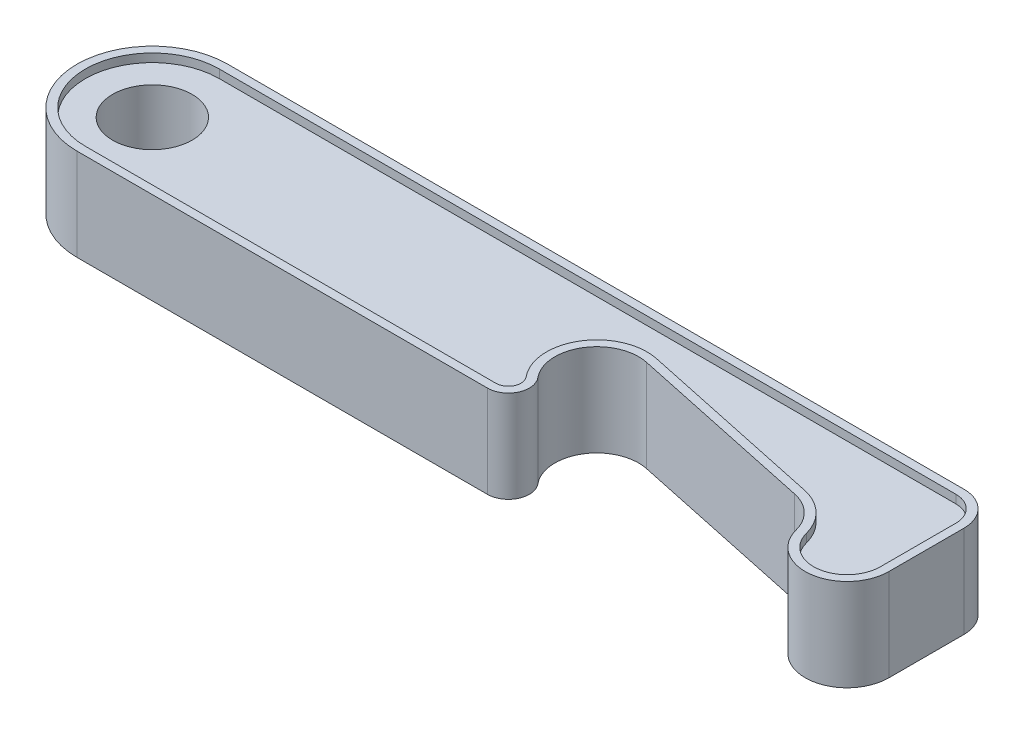
ISO-10303-21;
HEADER;
FILE_DESCRIPTION(('STEP AP214'),'2;1');
FILE_NAME('part.step','',(''),(''),'','','');
FILE_SCHEMA(('AUTOMOTIVE_DESIGN { 1 0 10303 214 1 1 1 1 }'));
ENDSEC;
DATA;
#1=APPLICATION_CONTEXT('core data for automotive mechanical design processes');
#2=APPLICATION_PROTOCOL_DEFINITION('international standard','automotive_design',2000,#1);
#3=PRODUCT_CONTEXT('',#1,'mechanical');
#4=PRODUCT('Part','Part','',(#3));
#5=PRODUCT_RELATED_PRODUCT_CATEGORY('part','',(#4));
#6=PRODUCT_DEFINITION_FORMATION('','',#4);
#7=PRODUCT_DEFINITION_CONTEXT('part definition',#1,'design');
#8=PRODUCT_DEFINITION('design','',#6,#7);
#9=PRODUCT_DEFINITION_SHAPE('','',#8);
#10=(LENGTH_UNIT() NAMED_UNIT(*) SI_UNIT(.MILLI.,.METRE.));
#11=(NAMED_UNIT(*) PLANE_ANGLE_UNIT() SI_UNIT($,.RADIAN.));
#12=(NAMED_UNIT(*) SI_UNIT($,.STERADIAN.) SOLID_ANGLE_UNIT());
#13=UNCERTAINTY_MEASURE_WITH_UNIT(LENGTH_MEASURE(1.E-05),#10,'distance_accuracy_value','');
#14=(GEOMETRIC_REPRESENTATION_CONTEXT(3) GLOBAL_UNCERTAINTY_ASSIGNED_CONTEXT((#13)) GLOBAL_UNIT_ASSIGNED_CONTEXT((#10,
#11,#12)) REPRESENTATION_CONTEXT('',''));
#15=CARTESIAN_POINT('',(0.,0.,0.));
#16=DIRECTION('',(0.,0.,1.));
#17=DIRECTION('',(1.,0.,0.));
#18=AXIS2_PLACEMENT_3D('',#15,#16,#17);
#19=CARTESIAN_POINT('',(0.,-4.5,0.));
#20=DIRECTION('',(0.,1.,0.));
#21=DIRECTION('',(0.,0.,1.));
#22=AXIS2_PLACEMENT_3D('',#19,#20,#21);
#23=CYLINDRICAL_SURFACE('',#22,4.75);
#24=CARTESIAN_POINT('',(0.,-4.5,0.));
#25=DIRECTION('',(0.,1.,0.));
#26=DIRECTION('',(0.,0.,1.));
#27=AXIS2_PLACEMENT_3D('',#24,#25,#26);
#28=CIRCLE('',#27,4.75);
#29=CARTESIAN_POINT('',(0.,-4.5,4.75));
#30=VERTEX_POINT('',#29);
#31=EDGE_CURVE('E447',#30,#30,#28,.T.);
#32=ORIENTED_EDGE('',*,*,#31,.F.);
#33=EDGE_LOOP('',(#32));
#34=FACE_BOUND('',#33,.T.);
#35=CARTESIAN_POINT('',(0.,4.5,0.));
#36=DIRECTION('',(0.,1.,0.));
#37=DIRECTION('',(0.,0.,1.));
#38=AXIS2_PLACEMENT_3D('',#35,#36,#37);
#39=CIRCLE('',#38,4.75);
#40=CARTESIAN_POINT('',(0.,4.5,4.75));
#41=VERTEX_POINT('',#40);
#42=EDGE_CURVE('E367',#41,#41,#39,.T.);
#43=ORIENTED_EDGE('',*,*,#42,.T.);
#44=EDGE_LOOP('',(#43));
#45=FACE_BOUND('',#44,.T.);
#46=ADVANCED_FACE('F43',(#34,#45),#23,.F.);
#47=CARTESIAN_POINT('',(0.,-4.5,0.));
#48=DIRECTION('',(0.,1.,0.));
#49=DIRECTION('',(0.,0.,1.));
#50=AXIS2_PLACEMENT_3D('',#47,#48,#49);
#51=PLANE('',#50);
#52=ORIENTED_EDGE('',*,*,#31,.T.);
#53=EDGE_LOOP('',(#52));
#54=FACE_BOUND('',#53,.T.);
#55=DIRECTION('',(1.,0.,0.));
#56=VECTOR('',#55,1.);
#57=CARTESIAN_POINT('',(0.,-4.5,-8.));
#58=LINE('',#57,#56);
#59=CARTESIAN_POINT('',(0.,-4.5,-8.));
#60=VERTEX_POINT('',#59);
#61=CARTESIAN_POINT('',(88.,-4.5,-8.));
#62=VERTEX_POINT('',#61);
#63=EDGE_CURVE('E446',#60,#62,#58,.T.);
#64=ORIENTED_EDGE('',*,*,#63,.T.);
#65=CARTESIAN_POINT('',(88.,-4.5,-5.));
#66=DIRECTION('',(0.,1.,0.));
#67=DIRECTION('',(0.,0.,1.));
#68=AXIS2_PLACEMENT_3D('',#65,#66,#67);
#69=CIRCLE('',#68,3.);
#70=CARTESIAN_POINT('',(91.,-4.5,-5.));
#71=VERTEX_POINT('',#70);
#72=EDGE_CURVE('E11',#71,#62,#69,.T.);
#73=ORIENTED_EDGE('',*,*,#72,.F.);
#74=DIRECTION('',(0.,0.,1.));
#75=VECTOR('',#74,1.);
#76=CARTESIAN_POINT('',(91.,-4.5,0.));
#77=LINE('',#76,#75);
#78=CARTESIAN_POINT('',(91.,-4.5,3.99999999999999));
#79=VERTEX_POINT('',#78);
#80=EDGE_CURVE('E49',#71,#79,#77,.T.);
#81=ORIENTED_EDGE('',*,*,#80,.T.);
#82=CARTESIAN_POINT('',(87.,-4.5,4.));
#83=DIRECTION('',(0.,1.,0.));
#84=DIRECTION('',(0.,0.,1.));
#85=AXIS2_PLACEMENT_3D('',#82,#83,#84);
#86=CIRCLE('',#85,4.);
#87=CARTESIAN_POINT('',(83.1270166537926,-4.5,5.));
#88=VERTEX_POINT('',#87);
#89=EDGE_CURVE('E468',#88,#79,#86,.T.);
#90=ORIENTED_EDGE('',*,*,#89,.F.);
#91=CARTESIAN_POINT('',(77.3175416344815,-4.5,6.5));
#92=DIRECTION('',(0.,1.,0.));
#93=DIRECTION('',(0.,0.,1.));
#94=AXIS2_PLACEMENT_3D('',#91,#92,#93);
#95=CIRCLE('',#94,6.);
#96=CARTESIAN_POINT('',(78.565011779388,-4.5,0.631114395597172));
#97=VERTEX_POINT('',#96);
#98=EDGE_CURVE('E464',#88,#97,#95,.T.);
#99=ORIENTED_EDGE('',*,*,#98,.T.);
#100=DIRECTION('',(0.978147600733805,0.,0.20791169081776));
#101=VECTOR('',#100,1.);
#102=CARTESIAN_POINT('',(3.26780239401435,-4.5,-15.3738015347056));
#103=LINE('',#102,#101);
#104=CARTESIAN_POINT('',(56.065011779388,-4.5,-4.15140824197835));
#105=VERTEX_POINT('',#104);
#106=EDGE_CURVE('E462',#105,#97,#103,.T.);
#107=ORIENTED_EDGE('',*,*,#106,.F.);
#108=CARTESIAN_POINT('',(54.8175416344815,-4.5,1.71747736242447));
#109=DIRECTION('',(0.,1.,0.));
#110=DIRECTION('',(0.,0.,1.));
#111=AXIS2_PLACEMENT_3D('',#108,#109,#110);
#112=CIRCLE('',#111,5.99999999999998);
#113=CARTESIAN_POINT('',(50.1956821146032,-4.5,5.5434954724849));
#114=VERTEX_POINT('',#113);
#115=EDGE_CURVE('E456',#105,#114,#112,.T.);
#116=ORIENTED_EDGE('',*,*,#115,.T.);
#117=CARTESIAN_POINT('',(49.0402172346336,-4.5,6.5));
#118=DIRECTION('',(0.,1.,0.));
#119=DIRECTION('',(0.,0.,1.));
#120=AXIS2_PLACEMENT_3D('',#117,#118,#119);
#121=CIRCLE('',#120,1.5);
#122=CARTESIAN_POINT('',(49.0402172346336,-4.5,8.));
#123=VERTEX_POINT('',#122);
#124=EDGE_CURVE('E457',#123,#114,#121,.T.);
#125=ORIENTED_EDGE('',*,*,#124,.F.);
#126=DIRECTION('',(1.,0.,0.));
#127=VECTOR('',#126,1.);
#128=CARTESIAN_POINT('',(0.,-4.5,8.));
#129=LINE('',#128,#127);
#130=CARTESIAN_POINT('',(0.,-4.5,8.));
#131=VERTEX_POINT('',#130);
#132=EDGE_CURVE('E452',#131,#123,#129,.T.);
#133=ORIENTED_EDGE('',*,*,#132,.F.);
#134=CARTESIAN_POINT('',(0.,-4.5,0.));
#135=DIRECTION('',(0.,1.,0.));
#136=DIRECTION('',(0.,0.,1.));
#137=AXIS2_PLACEMENT_3D('',#134,#135,#136);
#138=CIRCLE('',#137,8.);
#139=EDGE_CURVE('E455',#60,#131,#138,.T.);
#140=ORIENTED_EDGE('',*,*,#139,.F.);
#141=EDGE_LOOP('',(#64,#73,#81,#90,#99,#107,#116,#125,#133,#140));
#142=FACE_BOUND('',#141,.T.);
#143=ADVANCED_FACE('F473',(#54,#142),#51,.F.);
#144=CARTESIAN_POINT('',(0.,4.5,0.));
#145=DIRECTION('',(0.,1.,0.));
#146=DIRECTION('',(0.,0.,1.));
#147=AXIS2_PLACEMENT_3D('',#144,#145,#146);
#148=PLANE('',#147);
#149=ORIENTED_EDGE('',*,*,#42,.F.);
#150=EDGE_LOOP('',(#149));
#151=FACE_BOUND('',#150,.T.);
#152=DIRECTION('',(1.,0.,0.));
#153=VECTOR('',#152,1.);
#154=CARTESIAN_POINT('',(0.,4.5,-8.));
#155=LINE('',#154,#153);
#156=CARTESIAN_POINT('',(0.,4.5,-8.));
#157=VERTEX_POINT('',#156);
#158=CARTESIAN_POINT('',(88.,4.5,-8.));
#159=VERTEX_POINT('',#158);
#160=EDGE_CURVE('E422',#157,#159,#155,.T.);
#161=ORIENTED_EDGE('',*,*,#160,.F.);
#162=CARTESIAN_POINT('',(0.,4.5,0.));
#163=DIRECTION('',(0.,1.,0.));
#164=DIRECTION('',(0.,0.,1.));
#165=AXIS2_PLACEMENT_3D('',#162,#163,#164);
#166=CIRCLE('',#165,8.);
#167=CARTESIAN_POINT('',(0.,4.5,8.));
#168=VERTEX_POINT('',#167);
#169=EDGE_CURVE('E250',#157,#168,#166,.T.);
#170=ORIENTED_EDGE('',*,*,#169,.T.);
#171=DIRECTION('',(1.,0.,0.));
#172=VECTOR('',#171,1.);
#173=CARTESIAN_POINT('',(0.,4.5,8.));
#174=LINE('',#173,#172);
#175=CARTESIAN_POINT('',(49.0402172346336,4.5,8.));
#176=VERTEX_POINT('',#175);
#177=EDGE_CURVE('E428',#168,#176,#174,.T.);
#178=ORIENTED_EDGE('',*,*,#177,.T.);
#179=CARTESIAN_POINT('',(49.0402172346336,4.5,6.5));
#180=DIRECTION('',(0.,1.,0.));
#181=DIRECTION('',(0.,0.,1.));
#182=AXIS2_PLACEMENT_3D('',#179,#180,#181);
#183=CIRCLE('',#182,1.5);
#184=CARTESIAN_POINT('',(50.1956821146032,4.5,5.5434954724849));
#185=VERTEX_POINT('',#184);
#186=EDGE_CURVE('E429',#176,#185,#183,.T.);
#187=ORIENTED_EDGE('',*,*,#186,.T.);
#188=CARTESIAN_POINT('',(54.8175416344815,4.5,1.71747736242447));
#189=DIRECTION('',(0.,1.,0.));
#190=DIRECTION('',(0.,0.,1.));
#191=AXIS2_PLACEMENT_3D('',#188,#189,#190);
#192=CIRCLE('',#191,5.99999999999998);
#193=CARTESIAN_POINT('',(56.065011779388,4.5,-4.15140824197835));
#194=VERTEX_POINT('',#193);
#195=EDGE_CURVE('E435',#194,#185,#192,.T.);
#196=ORIENTED_EDGE('',*,*,#195,.F.);
#197=DIRECTION('',(0.978147600733805,0.,0.20791169081776));
#198=VECTOR('',#197,1.);
#199=CARTESIAN_POINT('',(3.26780239401435,4.5,-15.3738015347056));
#200=LINE('',#199,#198);
#201=CARTESIAN_POINT('',(78.565011779388,4.5,0.631114395597172));
#202=VERTEX_POINT('',#201);
#203=EDGE_CURVE('E434',#194,#202,#200,.T.);
#204=ORIENTED_EDGE('',*,*,#203,.T.);
#205=CARTESIAN_POINT('',(77.3175416344815,4.5,6.5));
#206=DIRECTION('',(0.,1.,0.));
#207=DIRECTION('',(0.,0.,1.));
#208=AXIS2_PLACEMENT_3D('',#205,#206,#207);
#209=CIRCLE('',#208,6.);
#210=CARTESIAN_POINT('',(83.1270166537926,4.5,5.));
#211=VERTEX_POINT('',#210);
#212=EDGE_CURVE('E440',#211,#202,#209,.T.);
#213=ORIENTED_EDGE('',*,*,#212,.F.);
#214=CARTESIAN_POINT('',(87.,4.5,4.));
#215=DIRECTION('',(0.,1.,0.));
#216=DIRECTION('',(0.,0.,1.));
#217=AXIS2_PLACEMENT_3D('',#214,#215,#216);
#218=CIRCLE('',#217,4.);
#219=CARTESIAN_POINT('',(91.,4.5,3.99999999999999));
#220=VERTEX_POINT('',#219);
#221=EDGE_CURVE('E439',#211,#220,#218,.T.);
#222=ORIENTED_EDGE('',*,*,#221,.T.);
#223=DIRECTION('',(0.,0.,1.));
#224=VECTOR('',#223,1.);
#225=CARTESIAN_POINT('',(91.,4.5,0.));
#226=LINE('',#225,#224);
#227=CARTESIAN_POINT('',(91.,4.5,-5.));
#228=VERTEX_POINT('',#227);
#229=EDGE_CURVE('E445',#228,#220,#226,.T.);
#230=ORIENTED_EDGE('',*,*,#229,.F.);
#231=CARTESIAN_POINT('',(88.,4.5,-5.));
#232=DIRECTION('',(0.,1.,0.));
#233=DIRECTION('',(0.,0.,1.));
#234=AXIS2_PLACEMENT_3D('',#231,#232,#233);
#235=CIRCLE('',#234,3.);
#236=EDGE_CURVE('E63',#228,#159,#235,.T.);
#237=ORIENTED_EDGE('',*,*,#236,.T.);
#238=EDGE_LOOP('',(#161,#170,#178,#187,#196,#204,#213,#222,#230,#237));
#239=FACE_BOUND('',#238,.T.);
#240=ADVANCED_FACE('F511',(#151,#239),#148,.T.);
#241=CARTESIAN_POINT('',(0.,-5.5,-8.));
#242=DIRECTION('',(0.,0.,1.));
#243=DIRECTION('',(1.,0.,0.));
#244=AXIS2_PLACEMENT_3D('',#241,#242,#243);
#245=PLANE('',#244);
#246=ORIENTED_EDGE('',*,*,#63,.F.);
#247=DIRECTION('',(0.,1.,0.));
#248=VECTOR('',#247,1.);
#249=CARTESIAN_POINT('',(0.,-5.5,-8.));
#250=LINE('',#249,#248);
#251=CARTESIAN_POINT('',(0.,-5.5,-8.));
#252=VERTEX_POINT('',#251);
#253=EDGE_CURVE('E247',#252,#60,#250,.T.);
#254=ORIENTED_EDGE('',*,*,#253,.F.);
#255=DIRECTION('',(1.,0.,0.));
#256=VECTOR('',#255,1.);
#257=CARTESIAN_POINT('',(0.,-5.5,-8.));
#258=LINE('',#257,#256);
#259=CARTESIAN_POINT('',(88.,-5.5,-8.));
#260=VERTEX_POINT('',#259);
#261=EDGE_CURVE('E325',#252,#260,#258,.T.);
#262=ORIENTED_EDGE('',*,*,#261,.T.);
#263=DIRECTION('',(0.,1.,0.));
#264=VECTOR('',#263,1.);
#265=CARTESIAN_POINT('',(88.,-5.5,-8.));
#266=LINE('',#265,#264);
#267=EDGE_CURVE('E420',#260,#62,#266,.T.);
#268=ORIENTED_EDGE('',*,*,#267,.T.);
#269=EDGE_LOOP('',(#246,#254,#262,#268));
#270=FACE_BOUND('',#269,.T.);
#271=ADVANCED_FACE('F512',(#270),#245,.T.);
#272=CARTESIAN_POINT('',(91.,-5.5,0.));
#273=DIRECTION('',(-1.,0.,0.));
#274=DIRECTION('',(0.,0.,1.));
#275=AXIS2_PLACEMENT_3D('',#272,#273,#274);
#276=PLANE('',#275);
#277=ORIENTED_EDGE('',*,*,#80,.F.);
#278=DIRECTION('',(0.,1.,0.));
#279=VECTOR('',#278,1.);
#280=CARTESIAN_POINT('',(91.,-5.5,-5.));
#281=LINE('',#280,#279);
#282=CARTESIAN_POINT('',(91.,-5.5,-5.));
#283=VERTEX_POINT('',#282);
#284=EDGE_CURVE('E414',#283,#71,#281,.T.);
#285=ORIENTED_EDGE('',*,*,#284,.F.);
#286=DIRECTION('',(0.,0.,1.));
#287=VECTOR('',#286,1.);
#288=CARTESIAN_POINT('',(91.,-5.5,0.));
#289=LINE('',#288,#287);
#290=CARTESIAN_POINT('',(91.,-5.5,3.99999999999999));
#291=VERTEX_POINT('',#290);
#292=EDGE_CURVE('E330',#283,#291,#289,.T.);
#293=ORIENTED_EDGE('',*,*,#292,.T.);
#294=DIRECTION('',(0.,1.,0.));
#295=VECTOR('',#294,1.);
#296=CARTESIAN_POINT('',(91.,-5.5,3.99999999999999));
#297=LINE('',#296,#295);
#298=EDGE_CURVE('E413',#291,#79,#297,.T.);
#299=ORIENTED_EDGE('',*,*,#298,.T.);
#300=EDGE_LOOP('',(#277,#285,#293,#299));
#301=FACE_BOUND('',#300,.T.);
#302=ADVANCED_FACE('F471',(#301),#276,.T.);
#303=CARTESIAN_POINT('',(0.,-5.5,8.));
#304=DIRECTION('',(0.,0.,1.));
#305=DIRECTION('',(1.,0.,0.));
#306=AXIS2_PLACEMENT_3D('',#303,#304,#305);
#307=PLANE('',#306);
#308=DIRECTION('',(0.,1.,0.));
#309=VECTOR('',#308,1.);
#310=CARTESIAN_POINT('',(0.,-5.5,8.));
#311=LINE('',#310,#309);
#312=CARTESIAN_POINT('',(0.,-5.5,8.));
#313=VERTEX_POINT('',#312);
#314=EDGE_CURVE('E386',#313,#131,#311,.T.);
#315=ORIENTED_EDGE('',*,*,#314,.T.);
#316=ORIENTED_EDGE('',*,*,#132,.T.);
#317=DIRECTION('',(0.,1.,0.));
#318=VECTOR('',#317,1.);
#319=CARTESIAN_POINT('',(49.0402172346336,-5.5,8.));
#320=LINE('',#319,#318);
#321=CARTESIAN_POINT('',(49.0402172346336,-5.5,8.));
#322=VERTEX_POINT('',#321);
#323=EDGE_CURVE('E394',#322,#123,#320,.T.);
#324=ORIENTED_EDGE('',*,*,#323,.F.);
#325=DIRECTION('',(1.,0.,0.));
#326=VECTOR('',#325,1.);
#327=CARTESIAN_POINT('',(0.,-5.5,8.));
#328=LINE('',#327,#326);
#329=EDGE_CURVE('E343',#313,#322,#328,.T.);
#330=ORIENTED_EDGE('',*,*,#329,.F.);
#331=EDGE_LOOP('',(#315,#316,#324,#330));
#332=FACE_BOUND('',#331,.T.);
#333=ADVANCED_FACE('F503',(#332),#307,.F.);
#334=CARTESIAN_POINT('',(0.,-5.5,0.));
#335=DIRECTION('',(0.,1.,0.));
#336=DIRECTION('',(0.,0.,1.));
#337=AXIS2_PLACEMENT_3D('',#334,#335,#336);
#338=CYLINDRICAL_SURFACE('',#337,8.);
#339=ORIENTED_EDGE('',*,*,#253,.T.);
#340=ORIENTED_EDGE('',*,*,#139,.T.);
#341=ORIENTED_EDGE('',*,*,#314,.F.);
#342=CARTESIAN_POINT('',(0.,-5.5,0.));
#343=DIRECTION('',(0.,1.,0.));
#344=DIRECTION('',(0.,0.,1.));
#345=AXIS2_PLACEMENT_3D('',#342,#343,#344);
#346=CIRCLE('',#345,8.);
#347=EDGE_CURVE('E317',#252,#313,#346,.T.);
#348=ORIENTED_EDGE('',*,*,#347,.F.);
#349=EDGE_LOOP('',(#339,#340,#341,#348));
#350=FACE_BOUND('',#349,.T.);
#351=ADVANCED_FACE('F507',(#350),#338,.F.);
#352=CARTESIAN_POINT('',(49.0402172346336,-5.5,6.5));
#353=DIRECTION('',(0.,1.,0.));
#354=DIRECTION('',(0.,0.,1.));
#355=AXIS2_PLACEMENT_3D('',#352,#353,#354);
#356=CYLINDRICAL_SURFACE('',#355,1.5);
#357=ORIENTED_EDGE('',*,*,#323,.T.);
#358=ORIENTED_EDGE('',*,*,#124,.T.);
#359=DIRECTION('',(0.,1.,0.));
#360=VECTOR('',#359,1.);
#361=CARTESIAN_POINT('',(50.1956821146032,-5.5,5.5434954724849));
#362=LINE('',#361,#360);
#363=CARTESIAN_POINT('',(50.1956821146032,-5.5,5.5434954724849));
#364=VERTEX_POINT('',#363);
#365=EDGE_CURVE('E400',#364,#114,#362,.T.);
#366=ORIENTED_EDGE('',*,*,#365,.F.);
#367=CARTESIAN_POINT('',(49.0402172346336,-5.5,6.5));
#368=DIRECTION('',(0.,1.,0.));
#369=DIRECTION('',(0.,0.,1.));
#370=AXIS2_PLACEMENT_3D('',#367,#368,#369);
#371=CIRCLE('',#370,1.5);
#372=EDGE_CURVE('E336',#322,#364,#371,.T.);
#373=ORIENTED_EDGE('',*,*,#372,.F.);
#374=EDGE_LOOP('',(#357,#358,#366,#373));
#375=FACE_BOUND('',#374,.T.);
#376=ADVANCED_FACE('F498',(#375),#356,.F.);
#377=CARTESIAN_POINT('',(54.8175416344815,-5.5,1.71747736242447));
#378=DIRECTION('',(0.,1.,0.));
#379=DIRECTION('',(0.,0.,1.));
#380=AXIS2_PLACEMENT_3D('',#377,#378,#379);
#381=CYLINDRICAL_SURFACE('',#380,5.99999999999998);
#382=ORIENTED_EDGE('',*,*,#115,.F.);
#383=DIRECTION('',(0.,1.,0.));
#384=VECTOR('',#383,1.);
#385=CARTESIAN_POINT('',(56.065011779388,-5.5,-4.15140824197835));
#386=LINE('',#385,#384);
#387=CARTESIAN_POINT('',(56.065011779388,-5.5,-4.15140824197835));
#388=VERTEX_POINT('',#387);
#389=EDGE_CURVE('E402',#388,#105,#386,.T.);
#390=ORIENTED_EDGE('',*,*,#389,.F.);
#391=CARTESIAN_POINT('',(54.8175416344815,-5.5,1.71747736242447));
#392=DIRECTION('',(0.,1.,0.));
#393=DIRECTION('',(0.,0.,1.));
#394=AXIS2_PLACEMENT_3D('',#391,#392,#393);
#395=CIRCLE('',#394,5.99999999999998);
#396=EDGE_CURVE('E337',#388,#364,#395,.T.);
#397=ORIENTED_EDGE('',*,*,#396,.T.);
#398=ORIENTED_EDGE('',*,*,#365,.T.);
#399=EDGE_LOOP('',(#382,#390,#397,#398));
#400=FACE_BOUND('',#399,.T.);
#401=ADVANCED_FACE('F497',(#400),#381,.T.);
#402=CARTESIAN_POINT('',(3.26780239401435,-5.5,-15.3738015347056));
#403=DIRECTION('',(-0.20791169081776,0.,0.978147600733806));
#404=DIRECTION('',(0.978147600733806,0.,0.20791169081776));
#405=AXIS2_PLACEMENT_3D('',#402,#403,#404);
#406=PLANE('',#405);
#407=ORIENTED_EDGE('',*,*,#389,.T.);
#408=ORIENTED_EDGE('',*,*,#106,.T.);
#409=DIRECTION('',(0.,1.,0.));
#410=VECTOR('',#409,1.);
#411=CARTESIAN_POINT('',(78.565011779388,-5.5,0.631114395597172));
#412=LINE('',#411,#410);
#413=CARTESIAN_POINT('',(78.565011779388,-5.5,0.631114395597172));
#414=VERTEX_POINT('',#413);
#415=EDGE_CURVE('E60',#414,#97,#412,.T.);
#416=ORIENTED_EDGE('',*,*,#415,.F.);
#417=DIRECTION('',(0.978147600733805,0.,0.20791169081776));
#418=VECTOR('',#417,1.);
#419=CARTESIAN_POINT('',(3.26780239401435,-5.5,-15.3738015347056));
#420=LINE('',#419,#418);
#421=EDGE_CURVE('E331',#388,#414,#420,.T.);
#422=ORIENTED_EDGE('',*,*,#421,.F.);
#423=EDGE_LOOP('',(#407,#408,#416,#422));
#424=FACE_BOUND('',#423,.T.);
#425=ADVANCED_FACE('F495',(#424),#406,.F.);
#426=CARTESIAN_POINT('',(77.3175416344815,-5.5,6.5));
#427=DIRECTION('',(0.,1.,0.));
#428=DIRECTION('',(0.,0.,1.));
#429=AXIS2_PLACEMENT_3D('',#426,#427,#428);
#430=CYLINDRICAL_SURFACE('',#429,6.);
#431=ORIENTED_EDGE('',*,*,#98,.F.);
#432=DIRECTION('',(0.,1.,0.));
#433=VECTOR('',#432,1.);
#434=CARTESIAN_POINT('',(83.1270166537926,-5.5,5.));
#435=LINE('',#434,#433);
#436=CARTESIAN_POINT('',(83.1270166537926,-5.5,5.));
#437=VERTEX_POINT('',#436);
#438=EDGE_CURVE('E410',#437,#88,#435,.T.);
#439=ORIENTED_EDGE('',*,*,#438,.F.);
#440=CARTESIAN_POINT('',(77.3175416344815,-5.5,6.5));
#441=DIRECTION('',(0.,1.,0.));
#442=DIRECTION('',(0.,0.,1.));
#443=AXIS2_PLACEMENT_3D('',#440,#441,#442);
#444=CIRCLE('',#443,6.);
#445=EDGE_CURVE('E335',#437,#414,#444,.T.);
#446=ORIENTED_EDGE('',*,*,#445,.T.);
#447=ORIENTED_EDGE('',*,*,#415,.T.);
#448=EDGE_LOOP('',(#431,#439,#446,#447));
#449=FACE_BOUND('',#448,.T.);
#450=ADVANCED_FACE('F488',(#449),#430,.T.);
#451=CARTESIAN_POINT('',(87.,-5.5,4.));
#452=DIRECTION('',(0.,1.,0.));
#453=DIRECTION('',(0.,0.,1.));
#454=AXIS2_PLACEMENT_3D('',#451,#452,#453);
#455=CYLINDRICAL_SURFACE('',#454,4.);
#456=ORIENTED_EDGE('',*,*,#438,.T.);
#457=ORIENTED_EDGE('',*,*,#89,.T.);
#458=ORIENTED_EDGE('',*,*,#298,.F.);
#459=CARTESIAN_POINT('',(87.,-5.5,4.));
#460=DIRECTION('',(0.,1.,0.));
#461=DIRECTION('',(0.,0.,1.));
#462=AXIS2_PLACEMENT_3D('',#459,#460,#461);
#463=CIRCLE('',#462,4.);
#464=EDGE_CURVE('E329',#437,#291,#463,.T.);
#465=ORIENTED_EDGE('',*,*,#464,.F.);
#466=EDGE_LOOP('',(#456,#457,#458,#465));
#467=FACE_BOUND('',#466,.T.);
#468=ADVANCED_FACE('F490',(#467),#455,.F.);
#469=CARTESIAN_POINT('',(88.,-5.5,-5.));
#470=DIRECTION('',(0.,1.,0.));
#471=DIRECTION('',(0.,0.,1.));
#472=AXIS2_PLACEMENT_3D('',#469,#470,#471);
#473=CYLINDRICAL_SURFACE('',#472,3.);
#474=ORIENTED_EDGE('',*,*,#284,.T.);
#475=ORIENTED_EDGE('',*,*,#72,.T.);
#476=ORIENTED_EDGE('',*,*,#267,.F.);
#477=CARTESIAN_POINT('',(88.,-5.5,-5.));
#478=DIRECTION('',(0.,1.,0.));
#479=DIRECTION('',(0.,0.,1.));
#480=AXIS2_PLACEMENT_3D('',#477,#478,#479);
#481=CIRCLE('',#480,3.);
#482=EDGE_CURVE('E324',#283,#260,#481,.T.);
#483=ORIENTED_EDGE('',*,*,#482,.F.);
#484=EDGE_LOOP('',(#474,#475,#476,#483));
#485=FACE_BOUND('',#484,.T.);
#486=ADVANCED_FACE('F480',(#485),#473,.F.);
#487=CARTESIAN_POINT('',(77.3175416344815,-5.5,6.5));
#488=DIRECTION('',(0.,1.,0.));
#489=DIRECTION('',(0.,0.,1.));
#490=AXIS2_PLACEMENT_3D('',#487,#488,#489);
#491=CYLINDRICAL_SURFACE('',#490,5.);
#492=DIRECTION('',(0.,1.,0.));
#493=VECTOR('',#492,1.);
#494=CARTESIAN_POINT('',(82.1587708172407,-5.5,5.25));
#495=LINE('',#494,#493);
#496=CARTESIAN_POINT('',(82.1587708172407,-5.5,5.25));
#497=VERTEX_POINT('',#496);
#498=CARTESIAN_POINT('',(82.1587708172407,5.5,5.25));
#499=VERTEX_POINT('',#498);
#500=EDGE_CURVE('E390',#497,#499,#495,.T.);
#501=ORIENTED_EDGE('',*,*,#500,.T.);
#502=CARTESIAN_POINT('',(77.3175416344815,5.5,6.5));
#503=DIRECTION('',(0.,1.,0.));
#504=DIRECTION('',(0.,0.,1.));
#505=AXIS2_PLACEMENT_3D('',#502,#503,#504);
#506=CIRCLE('',#505,5.);
#507=CARTESIAN_POINT('',(78.3571000885703,5.5,1.60926199633098));
#508=VERTEX_POINT('',#507);
#509=EDGE_CURVE('E287',#499,#508,#506,.T.);
#510=ORIENTED_EDGE('',*,*,#509,.T.);
#511=DIRECTION('',(0.,1.,0.));
#512=VECTOR('',#511,1.);
#513=CARTESIAN_POINT('',(78.3571000885703,-5.5,1.60926199633098));
#514=LINE('',#513,#512);
#515=CARTESIAN_POINT('',(78.3571000885703,-5.5,1.60926199633098));
#516=VERTEX_POINT('',#515);
#517=EDGE_CURVE('E366',#516,#508,#514,.T.);
#518=ORIENTED_EDGE('',*,*,#517,.F.);
#519=CARTESIAN_POINT('',(77.3175416344815,-5.5,6.5));
#520=DIRECTION('',(0.,1.,0.));
#521=DIRECTION('',(0.,0.,1.));
#522=AXIS2_PLACEMENT_3D('',#519,#520,#521);
#523=CIRCLE('',#522,5.);
#524=EDGE_CURVE('E341',#497,#516,#523,.T.);
#525=ORIENTED_EDGE('',*,*,#524,.F.);
#526=EDGE_LOOP('',(#501,#510,#518,#525));
#527=FACE_BOUND('',#526,.T.);
#528=ADVANCED_FACE('F585',(#527),#491,.F.);
#529=CARTESIAN_POINT('',(3.05989070319659,-5.5,-14.3956539339718));
#530=DIRECTION('',(-0.20791169081776,0.,0.978147600733806));
#531=DIRECTION('',(0.978147600733806,0.,0.20791169081776));
#532=AXIS2_PLACEMENT_3D('',#529,#530,#531);
#533=PLANE('',#532);
#534=ORIENTED_EDGE('',*,*,#517,.T.);
#535=DIRECTION('',(0.978147600733805,0.,0.20791169081776));
#536=VECTOR('',#535,1.);
#537=CARTESIAN_POINT('',(3.05989070319659,5.5,-14.3956539339718));
#538=LINE('',#537,#536);
#539=CARTESIAN_POINT('',(55.8571000885703,5.5,-3.17326064124454));
#540=VERTEX_POINT('',#539);
#541=EDGE_CURVE('E316',#540,#508,#538,.T.);
#542=ORIENTED_EDGE('',*,*,#541,.F.);
#543=DIRECTION('',(0.,1.,0.));
#544=VECTOR('',#543,1.);
#545=CARTESIAN_POINT('',(55.8571000885703,-5.5,-3.17326064124454));
#546=LINE('',#545,#544);
#547=CARTESIAN_POINT('',(55.8571000885703,-5.5,-3.17326064124454));
#548=VERTEX_POINT('',#547);
#549=EDGE_CURVE('E371',#548,#540,#546,.T.);
#550=ORIENTED_EDGE('',*,*,#549,.F.);
#551=DIRECTION('',(0.978147600733805,0.,0.20791169081776));
#552=VECTOR('',#551,1.);
#553=CARTESIAN_POINT('',(3.05989070319659,-5.5,-14.3956539339718));
#554=LINE('',#553,#552);
#555=EDGE_CURVE('E249',#548,#516,#554,.T.);
#556=ORIENTED_EDGE('',*,*,#555,.T.);
#557=EDGE_LOOP('',(#534,#542,#550,#556));
#558=FACE_BOUND('',#557,.T.);
#559=ADVANCED_FACE('F590',(#558),#533,.T.);
#560=CARTESIAN_POINT('',(54.8175416344815,-5.5,1.71747736242447));
#561=DIRECTION('',(0.,1.,0.));
#562=DIRECTION('',(0.,0.,1.));
#563=AXIS2_PLACEMENT_3D('',#560,#561,#562);
#564=CYLINDRICAL_SURFACE('',#563,4.99999999999998);
#565=ORIENTED_EDGE('',*,*,#549,.T.);
#566=CARTESIAN_POINT('',(54.8175416344815,5.5,1.71747736242447));
#567=DIRECTION('',(0.,1.,0.));
#568=DIRECTION('',(0.,0.,1.));
#569=AXIS2_PLACEMENT_3D('',#566,#567,#568);
#570=CIRCLE('',#569,4.99999999999998);
#571=CARTESIAN_POINT('',(50.9659920345829,5.5,4.90582578747482));
#572=VERTEX_POINT('',#571);
#573=EDGE_CURVE('E311',#540,#572,#570,.T.);
#574=ORIENTED_EDGE('',*,*,#573,.T.);
#575=DIRECTION('',(0.,1.,0.));
#576=VECTOR('',#575,1.);
#577=CARTESIAN_POINT('',(50.9659920345829,-5.5,4.90582578747482));
#578=LINE('',#577,#576);
#579=CARTESIAN_POINT('',(50.9659920345829,-5.5,4.90582578747482));
#580=VERTEX_POINT('',#579);
#581=EDGE_CURVE('E373',#580,#572,#578,.T.);
#582=ORIENTED_EDGE('',*,*,#581,.F.);
#583=CARTESIAN_POINT('',(54.8175416344815,-5.5,1.71747736242447));
#584=DIRECTION('',(0.,1.,0.));
#585=DIRECTION('',(0.,0.,1.));
#586=AXIS2_PLACEMENT_3D('',#583,#584,#585);
#587=CIRCLE('',#586,4.99999999999998);
#588=EDGE_CURVE('E365',#548,#580,#587,.T.);
#589=ORIENTED_EDGE('',*,*,#588,.F.);
#590=EDGE_LOOP('',(#565,#574,#582,#589));
#591=FACE_BOUND('',#590,.T.);
#592=ADVANCED_FACE('F613',(#591),#564,.F.);
#593=CARTESIAN_POINT('',(49.0402172346336,-5.5,6.5));
#594=DIRECTION('',(0.,1.,0.));
#595=DIRECTION('',(0.,0.,1.));
#596=AXIS2_PLACEMENT_3D('',#593,#594,#595);
#597=CYLINDRICAL_SURFACE('',#596,2.5);
#598=ORIENTED_EDGE('',*,*,#581,.T.);
#599=CARTESIAN_POINT('',(49.0402172346336,5.5,6.5));
#600=DIRECTION('',(0.,1.,0.));
#601=DIRECTION('',(0.,0.,1.));
#602=AXIS2_PLACEMENT_3D('',#599,#600,#601);
#603=CIRCLE('',#602,2.5);
#604=CARTESIAN_POINT('',(49.0402172346336,5.5,9.));
#605=VERTEX_POINT('',#604);
#606=EDGE_CURVE('E309',#605,#572,#603,.T.);
#607=ORIENTED_EDGE('',*,*,#606,.F.);
#608=DIRECTION('',(0.,1.,0.));
#609=VECTOR('',#608,1.);
#610=CARTESIAN_POINT('',(49.0402172346336,-5.5,9.));
#611=LINE('',#610,#609);
#612=CARTESIAN_POINT('',(49.0402172346336,-5.5,9.));
#613=VERTEX_POINT('',#612);
#614=EDGE_CURVE('E374',#613,#605,#611,.T.);
#615=ORIENTED_EDGE('',*,*,#614,.F.);
#616=CARTESIAN_POINT('',(49.0402172346336,-5.5,6.5));
#617=DIRECTION('',(0.,1.,0.));
#618=DIRECTION('',(0.,0.,1.));
#619=AXIS2_PLACEMENT_3D('',#616,#617,#618);
#620=CIRCLE('',#619,2.5);
#621=EDGE_CURVE('E363',#613,#580,#620,.T.);
#622=ORIENTED_EDGE('',*,*,#621,.T.);
#623=EDGE_LOOP('',(#598,#607,#615,#622));
#624=FACE_BOUND('',#623,.T.);
#625=ADVANCED_FACE('F612',(#624),#597,.T.);
#626=CARTESIAN_POINT('',(0.,-5.5,9.));
#627=DIRECTION('',(0.,0.,1.));
#628=DIRECTION('',(1.,0.,0.));
#629=AXIS2_PLACEMENT_3D('',#626,#627,#628);
#630=PLANE('',#629);
#631=ORIENTED_EDGE('',*,*,#614,.T.);
#632=DIRECTION('',(1.,0.,0.));
#633=VECTOR('',#632,1.);
#634=CARTESIAN_POINT('',(0.,5.5,9.));
#635=LINE('',#634,#633);
#636=CARTESIAN_POINT('',(0.,5.5,9.));
#637=VERTEX_POINT('',#636);
#638=EDGE_CURVE('E307',#637,#605,#635,.T.);
#639=ORIENTED_EDGE('',*,*,#638,.F.);
#640=DIRECTION('',(0.,1.,0.));
#641=VECTOR('',#640,1.);
#642=CARTESIAN_POINT('',(0.,-5.5,9.));
#643=LINE('',#642,#641);
#644=CARTESIAN_POINT('',(0.,-5.5,9.));
#645=VERTEX_POINT('',#644);
#646=EDGE_CURVE('E380',#645,#637,#643,.T.);
#647=ORIENTED_EDGE('',*,*,#646,.F.);
#648=DIRECTION('',(1.,0.,0.));
#649=VECTOR('',#648,1.);
#650=CARTESIAN_POINT('',(0.,-5.5,9.));
#651=LINE('',#650,#649);
#652=EDGE_CURVE('E356',#645,#613,#651,.T.);
#653=ORIENTED_EDGE('',*,*,#652,.T.);
#654=EDGE_LOOP('',(#631,#639,#647,#653));
#655=FACE_BOUND('',#654,.T.);
#656=ADVANCED_FACE('F610',(#655),#630,.T.);
#657=CARTESIAN_POINT('',(0.,-5.5,0.));
#658=DIRECTION('',(0.,1.,0.));
#659=DIRECTION('',(0.,0.,1.));
#660=AXIS2_PLACEMENT_3D('',#657,#658,#659);
#661=CYLINDRICAL_SURFACE('',#660,9.);
#662=ORIENTED_EDGE('',*,*,#646,.T.);
#663=CARTESIAN_POINT('',(0.,5.5,0.));
#664=DIRECTION('',(0.,1.,0.));
#665=DIRECTION('',(0.,0.,1.));
#666=AXIS2_PLACEMENT_3D('',#663,#664,#665);
#667=CIRCLE('',#666,9.);
#668=CARTESIAN_POINT('',(0.,5.5,-9.));
#669=VERTEX_POINT('',#668);
#670=EDGE_CURVE('E302',#669,#637,#667,.T.);
#671=ORIENTED_EDGE('',*,*,#670,.F.);
#672=DIRECTION('',(0.,1.,0.));
#673=VECTOR('',#672,1.);
#674=CARTESIAN_POINT('',(0.,-5.5,-9.));
#675=LINE('',#674,#673);
#676=CARTESIAN_POINT('',(0.,-5.5,-9.));
#677=VERTEX_POINT('',#676);
#678=EDGE_CURVE('E377',#677,#669,#675,.T.);
#679=ORIENTED_EDGE('',*,*,#678,.F.);
#680=CARTESIAN_POINT('',(0.,-5.5,0.));
#681=DIRECTION('',(0.,1.,0.));
#682=DIRECTION('',(0.,0.,1.));
#683=AXIS2_PLACEMENT_3D('',#680,#681,#682);
#684=CIRCLE('',#683,9.);
#685=EDGE_CURVE('E353',#677,#645,#684,.T.);
#686=ORIENTED_EDGE('',*,*,#685,.T.);
#687=EDGE_LOOP('',(#662,#671,#679,#686));
#688=FACE_BOUND('',#687,.T.);
#689=ADVANCED_FACE('F602',(#688),#661,.T.);
#690=CARTESIAN_POINT('',(0.,-5.5,-9.));
#691=DIRECTION('',(0.,0.,1.));
#692=DIRECTION('',(1.,0.,0.));
#693=AXIS2_PLACEMENT_3D('',#690,#691,#692);
#694=PLANE('',#693);
#695=ORIENTED_EDGE('',*,*,#678,.T.);
#696=DIRECTION('',(1.,0.,0.));
#697=VECTOR('',#696,1.);
#698=CARTESIAN_POINT('',(0.,5.5,-9.));
#699=LINE('',#698,#697);
#700=CARTESIAN_POINT('',(88.,5.5,-9.));
#701=VERTEX_POINT('',#700);
#702=EDGE_CURVE('E303',#669,#701,#699,.T.);
#703=ORIENTED_EDGE('',*,*,#702,.T.);
#704=DIRECTION('',(0.,1.,0.));
#705=VECTOR('',#704,1.);
#706=CARTESIAN_POINT('',(88.,-5.5,-9.));
#707=LINE('',#706,#705);
#708=CARTESIAN_POINT('',(88.,-5.5,-9.));
#709=VERTEX_POINT('',#708);
#710=EDGE_CURVE('E381',#709,#701,#707,.T.);
#711=ORIENTED_EDGE('',*,*,#710,.F.);
#712=DIRECTION('',(1.,0.,0.));
#713=VECTOR('',#712,1.);
#714=CARTESIAN_POINT('',(0.,-5.5,-9.));
#715=LINE('',#714,#713);
#716=EDGE_CURVE('E354',#677,#709,#715,.T.);
#717=ORIENTED_EDGE('',*,*,#716,.F.);
#718=EDGE_LOOP('',(#695,#703,#711,#717));
#719=FACE_BOUND('',#718,.T.);
#720=ADVANCED_FACE('F597',(#719),#694,.F.);
#721=CARTESIAN_POINT('',(88.,-5.5,-5.));
#722=DIRECTION('',(0.,1.,0.));
#723=DIRECTION('',(0.,0.,1.));
#724=AXIS2_PLACEMENT_3D('',#721,#722,#723);
#725=CYLINDRICAL_SURFACE('',#724,4.);
#726=ORIENTED_EDGE('',*,*,#710,.T.);
#727=CARTESIAN_POINT('',(88.,5.5,-5.));
#728=DIRECTION('',(0.,1.,0.));
#729=DIRECTION('',(0.,0.,1.));
#730=AXIS2_PLACEMENT_3D('',#727,#728,#729);
#731=CIRCLE('',#730,4.);
#732=CARTESIAN_POINT('',(92.,5.5,-5.));
#733=VERTEX_POINT('',#732);
#734=EDGE_CURVE('E299',#733,#701,#731,.T.);
#735=ORIENTED_EDGE('',*,*,#734,.F.);
#736=DIRECTION('',(0.,1.,0.));
#737=VECTOR('',#736,1.);
#738=CARTESIAN_POINT('',(92.,-5.5,-5.));
#739=LINE('',#738,#737);
#740=CARTESIAN_POINT('',(92.,-5.5,-5.));
#741=VERTEX_POINT('',#740);
#742=EDGE_CURVE('E382',#741,#733,#739,.T.);
#743=ORIENTED_EDGE('',*,*,#742,.F.);
#744=CARTESIAN_POINT('',(88.,-5.5,-5.));
#745=DIRECTION('',(0.,1.,0.));
#746=DIRECTION('',(0.,0.,1.));
#747=AXIS2_PLACEMENT_3D('',#744,#745,#746);
#748=CIRCLE('',#747,4.);
#749=EDGE_CURVE('E348',#741,#709,#748,.T.);
#750=ORIENTED_EDGE('',*,*,#749,.T.);
#751=EDGE_LOOP('',(#726,#735,#743,#750));
#752=FACE_BOUND('',#751,.T.);
#753=ADVANCED_FACE('F594',(#752),#725,.T.);
#754=CARTESIAN_POINT('',(92.,-5.5,0.));
#755=DIRECTION('',(-1.,0.,0.));
#756=DIRECTION('',(0.,0.,1.));
#757=AXIS2_PLACEMENT_3D('',#754,#755,#756);
#758=PLANE('',#757);
#759=ORIENTED_EDGE('',*,*,#742,.T.);
#760=DIRECTION('',(0.,0.,1.));
#761=VECTOR('',#760,1.);
#762=CARTESIAN_POINT('',(92.,5.5,0.));
#763=LINE('',#762,#761);
#764=CARTESIAN_POINT('',(92.,5.5,3.99999999999999));
#765=VERTEX_POINT('',#764);
#766=EDGE_CURVE('E293',#733,#765,#763,.T.);
#767=ORIENTED_EDGE('',*,*,#766,.T.);
#768=DIRECTION('',(0.,1.,0.));
#769=VECTOR('',#768,1.);
#770=CARTESIAN_POINT('',(92.,-5.5,3.99999999999999));
#771=LINE('',#770,#769);
#772=CARTESIAN_POINT('',(92.,-5.5,3.99999999999999));
#773=VERTEX_POINT('',#772);
#774=EDGE_CURVE('E384',#773,#765,#771,.T.);
#775=ORIENTED_EDGE('',*,*,#774,.F.);
#776=DIRECTION('',(0.,0.,1.));
#777=VECTOR('',#776,1.);
#778=CARTESIAN_POINT('',(92.,-5.5,0.));
#779=LINE('',#778,#777);
#780=EDGE_CURVE('E346',#741,#773,#779,.T.);
#781=ORIENTED_EDGE('',*,*,#780,.F.);
#782=EDGE_LOOP('',(#759,#767,#775,#781));
#783=FACE_BOUND('',#782,.T.);
#784=ADVANCED_FACE('F595',(#783),#758,.F.);
#785=ORIENTED_EDGE('',*,*,#169,.F.);
#786=CARTESIAN_POINT('',(0.,5.5,-8.));
#787=VERTEX_POINT('',#786);
#788=EDGE_CURVE('E238',#157,#787,#250,.T.);
#789=ORIENTED_EDGE('',*,*,#788,.T.);
#790=CARTESIAN_POINT('',(0.,5.5,0.));
#791=DIRECTION('',(0.,1.,0.));
#792=DIRECTION('',(0.,0.,1.));
#793=AXIS2_PLACEMENT_3D('',#790,#791,#792);
#794=CIRCLE('',#793,8.);
#795=CARTESIAN_POINT('',(0.,5.5,8.));
#796=VERTEX_POINT('',#795);
#797=EDGE_CURVE('E243',#787,#796,#794,.T.);
#798=ORIENTED_EDGE('',*,*,#797,.T.);
#799=EDGE_CURVE('E395',#168,#796,#311,.T.);
#800=ORIENTED_EDGE('',*,*,#799,.F.);
#801=EDGE_LOOP('',(#785,#789,#798,#800));
#802=FACE_BOUND('',#801,.T.);
#803=ADVANCED_FACE('F245',(#802),#338,.F.);
#804=ORIENTED_EDGE('',*,*,#177,.F.);
#805=ORIENTED_EDGE('',*,*,#799,.T.);
#806=DIRECTION('',(1.,0.,0.));
#807=VECTOR('',#806,1.);
#808=CARTESIAN_POINT('',(0.,5.5,8.));
#809=LINE('',#808,#807);
#810=CARTESIAN_POINT('',(49.0402172346336,5.5,8.));
#811=VERTEX_POINT('',#810);
#812=EDGE_CURVE('E266',#796,#811,#809,.T.);
#813=ORIENTED_EDGE('',*,*,#812,.T.);
#814=EDGE_CURVE('E398',#176,#811,#320,.T.);
#815=ORIENTED_EDGE('',*,*,#814,.F.);
#816=EDGE_LOOP('',(#804,#805,#813,#815));
#817=FACE_BOUND('',#816,.T.);
#818=ADVANCED_FACE('F567',(#817),#307,.F.);
#819=ORIENTED_EDGE('',*,*,#186,.F.);
#820=ORIENTED_EDGE('',*,*,#814,.T.);
#821=CARTESIAN_POINT('',(49.0402172346336,5.5,6.5));
#822=DIRECTION('',(0.,1.,0.));
#823=DIRECTION('',(0.,0.,1.));
#824=AXIS2_PLACEMENT_3D('',#821,#822,#823);
#825=CIRCLE('',#824,1.5);
#826=CARTESIAN_POINT('',(50.1956821146032,5.5,5.5434954724849));
#827=VERTEX_POINT('',#826);
#828=EDGE_CURVE('E283',#811,#827,#825,.T.);
#829=ORIENTED_EDGE('',*,*,#828,.T.);
#830=EDGE_CURVE('E399',#185,#827,#362,.T.);
#831=ORIENTED_EDGE('',*,*,#830,.F.);
#832=EDGE_LOOP('',(#819,#820,#829,#831));
#833=FACE_BOUND('',#832,.T.);
#834=ADVANCED_FACE('F561',(#833),#356,.F.);
#835=CARTESIAN_POINT('',(56.065011779388,5.5,-4.15140824197835));
#836=VERTEX_POINT('',#835);
#837=EDGE_CURVE('E404',#194,#836,#386,.T.);
#838=ORIENTED_EDGE('',*,*,#837,.F.);
#839=ORIENTED_EDGE('',*,*,#195,.T.);
#840=ORIENTED_EDGE('',*,*,#830,.T.);
#841=CARTESIAN_POINT('',(54.8175416344815,5.5,1.71747736242447));
#842=DIRECTION('',(0.,1.,0.));
#843=DIRECTION('',(0.,0.,1.));
#844=AXIS2_PLACEMENT_3D('',#841,#842,#843);
#845=CIRCLE('',#844,5.99999999999998);
#846=EDGE_CURVE('E285',#836,#827,#845,.T.);
#847=ORIENTED_EDGE('',*,*,#846,.F.);
#848=EDGE_LOOP('',(#838,#839,#840,#847));
#849=FACE_BOUND('',#848,.T.);
#850=ADVANCED_FACE('F556',(#849),#381,.T.);
#851=ORIENTED_EDGE('',*,*,#203,.F.);
#852=ORIENTED_EDGE('',*,*,#837,.T.);
#853=DIRECTION('',(0.978147600733805,0.,0.20791169081776));
#854=VECTOR('',#853,1.);
#855=CARTESIAN_POINT('',(3.26780239401435,5.5,-15.3738015347056));
#856=LINE('',#855,#854);
#857=CARTESIAN_POINT('',(78.565011779388,5.5,0.631114395597172));
#858=VERTEX_POINT('',#857);
#859=EDGE_CURVE('E276',#836,#858,#856,.T.);
#860=ORIENTED_EDGE('',*,*,#859,.T.);
#861=EDGE_CURVE('E407',#202,#858,#412,.T.);
#862=ORIENTED_EDGE('',*,*,#861,.F.);
#863=EDGE_LOOP('',(#851,#852,#860,#862));
#864=FACE_BOUND('',#863,.T.);
#865=ADVANCED_FACE('F553',(#864),#406,.F.);
#866=CARTESIAN_POINT('',(83.1270166537926,5.5,5.));
#867=VERTEX_POINT('',#866);
#868=EDGE_CURVE('E408',#211,#867,#435,.T.);
#869=ORIENTED_EDGE('',*,*,#868,.F.);
#870=ORIENTED_EDGE('',*,*,#212,.T.);
#871=ORIENTED_EDGE('',*,*,#861,.T.);
#872=CARTESIAN_POINT('',(77.3175416344815,5.5,6.5));
#873=DIRECTION('',(0.,1.,0.));
#874=DIRECTION('',(0.,0.,1.));
#875=AXIS2_PLACEMENT_3D('',#872,#873,#874);
#876=CIRCLE('',#875,6.);
#877=EDGE_CURVE('E277',#867,#858,#876,.T.);
#878=ORIENTED_EDGE('',*,*,#877,.F.);
#879=EDGE_LOOP('',(#869,#870,#871,#878));
#880=FACE_BOUND('',#879,.T.);
#881=ADVANCED_FACE('F549',(#880),#430,.T.);
#882=ORIENTED_EDGE('',*,*,#221,.F.);
#883=ORIENTED_EDGE('',*,*,#868,.T.);
#884=CARTESIAN_POINT('',(87.,5.5,4.));
#885=DIRECTION('',(0.,1.,0.));
#886=DIRECTION('',(0.,0.,1.));
#887=AXIS2_PLACEMENT_3D('',#884,#885,#886);
#888=CIRCLE('',#887,4.);
#889=CARTESIAN_POINT('',(91.,5.5,3.99999999999999));
#890=VERTEX_POINT('',#889);
#891=EDGE_CURVE('E272',#867,#890,#888,.T.);
#892=ORIENTED_EDGE('',*,*,#891,.T.);
#893=EDGE_CURVE('E412',#220,#890,#297,.T.);
#894=ORIENTED_EDGE('',*,*,#893,.F.);
#895=EDGE_LOOP('',(#882,#883,#892,#894));
#896=FACE_BOUND('',#895,.T.);
#897=ADVANCED_FACE('F546',(#896),#455,.F.);
#898=CARTESIAN_POINT('',(91.,5.5,-5.));
#899=VERTEX_POINT('',#898);
#900=EDGE_CURVE('E416',#228,#899,#281,.T.);
#901=ORIENTED_EDGE('',*,*,#900,.F.);
#902=ORIENTED_EDGE('',*,*,#229,.T.);
#903=ORIENTED_EDGE('',*,*,#893,.T.);
#904=DIRECTION('',(0.,0.,1.));
#905=VECTOR('',#904,1.);
#906=CARTESIAN_POINT('',(91.,5.5,0.));
#907=LINE('',#906,#905);
#908=EDGE_CURVE('E269',#899,#890,#907,.T.);
#909=ORIENTED_EDGE('',*,*,#908,.F.);
#910=EDGE_LOOP('',(#901,#902,#903,#909));
#911=FACE_BOUND('',#910,.T.);
#912=ADVANCED_FACE('F518',(#911),#276,.T.);
#913=ORIENTED_EDGE('',*,*,#236,.F.);
#914=ORIENTED_EDGE('',*,*,#900,.T.);
#915=CARTESIAN_POINT('',(88.,5.5,-5.));
#916=DIRECTION('',(0.,1.,0.));
#917=DIRECTION('',(0.,0.,1.));
#918=AXIS2_PLACEMENT_3D('',#915,#916,#917);
#919=CIRCLE('',#918,3.);
#920=CARTESIAN_POINT('',(88.,5.5,-8.));
#921=VERTEX_POINT('',#920);
#922=EDGE_CURVE('E257',#899,#921,#919,.T.);
#923=ORIENTED_EDGE('',*,*,#922,.T.);
#924=EDGE_CURVE('E258',#159,#921,#266,.T.);
#925=ORIENTED_EDGE('',*,*,#924,.F.);
#926=EDGE_LOOP('',(#913,#914,#923,#925));
#927=FACE_BOUND('',#926,.T.);
#928=ADVANCED_FACE('F527',(#927),#473,.F.);
#929=ORIENTED_EDGE('',*,*,#788,.F.);
#930=ORIENTED_EDGE('',*,*,#160,.T.);
#931=ORIENTED_EDGE('',*,*,#924,.T.);
#932=DIRECTION('',(1.,0.,0.));
#933=VECTOR('',#932,1.);
#934=CARTESIAN_POINT('',(0.,5.5,-8.));
#935=LINE('',#934,#933);
#936=EDGE_CURVE('E251',#787,#921,#935,.T.);
#937=ORIENTED_EDGE('',*,*,#936,.F.);
#938=EDGE_LOOP('',(#929,#930,#931,#937));
#939=FACE_BOUND('',#938,.T.);
#940=ADVANCED_FACE('F255',(#939),#245,.T.);
#941=CARTESIAN_POINT('',(87.,-5.5,4.));
#942=DIRECTION('',(0.,1.,0.));
#943=DIRECTION('',(0.,0.,1.));
#944=AXIS2_PLACEMENT_3D('',#941,#942,#943);
#945=CYLINDRICAL_SURFACE('',#944,5.00000000000001);
#946=ORIENTED_EDGE('',*,*,#774,.T.);
#947=CARTESIAN_POINT('',(87.,5.5,4.));
#948=DIRECTION('',(0.,1.,0.));
#949=DIRECTION('',(0.,0.,1.));
#950=AXIS2_PLACEMENT_3D('',#947,#948,#949);
#951=CIRCLE('',#950,5.00000000000001);
#952=EDGE_CURVE('E295',#499,#765,#951,.T.);
#953=ORIENTED_EDGE('',*,*,#952,.F.);
#954=ORIENTED_EDGE('',*,*,#500,.F.);
#955=CARTESIAN_POINT('',(87.,-5.5,4.));
#956=DIRECTION('',(0.,1.,0.));
#957=DIRECTION('',(0.,0.,1.));
#958=AXIS2_PLACEMENT_3D('',#955,#956,#957);
#959=CIRCLE('',#958,5.00000000000001);
#960=EDGE_CURVE('E344',#497,#773,#959,.T.);
#961=ORIENTED_EDGE('',*,*,#960,.T.);
#962=EDGE_LOOP('',(#946,#953,#954,#961));
#963=FACE_BOUND('',#962,.T.);
#964=ADVANCED_FACE('F528',(#963),#945,.T.);
#965=CARTESIAN_POINT('',(0.,-5.5,0.));
#966=DIRECTION('',(0.,1.,0.));
#967=DIRECTION('',(0.,0.,1.));
#968=AXIS2_PLACEMENT_3D('',#965,#966,#967);
#969=PLANE('',#968);
#970=ORIENTED_EDGE('',*,*,#347,.T.);
#971=ORIENTED_EDGE('',*,*,#329,.T.);
#972=ORIENTED_EDGE('',*,*,#372,.T.);
#973=ORIENTED_EDGE('',*,*,#396,.F.);
#974=ORIENTED_EDGE('',*,*,#421,.T.);
#975=ORIENTED_EDGE('',*,*,#445,.F.);
#976=ORIENTED_EDGE('',*,*,#464,.T.);
#977=ORIENTED_EDGE('',*,*,#292,.F.);
#978=ORIENTED_EDGE('',*,*,#482,.T.);
#979=ORIENTED_EDGE('',*,*,#261,.F.);
#980=EDGE_LOOP('',(#970,#971,#972,#973,#974,#975,#976,#977,#978,#979));
#981=FACE_BOUND('',#980,.T.);
#982=ORIENTED_EDGE('',*,*,#524,.T.);
#983=ORIENTED_EDGE('',*,*,#555,.F.);
#984=ORIENTED_EDGE('',*,*,#588,.T.);
#985=ORIENTED_EDGE('',*,*,#621,.F.);
#986=ORIENTED_EDGE('',*,*,#652,.F.);
#987=ORIENTED_EDGE('',*,*,#685,.F.);
#988=ORIENTED_EDGE('',*,*,#716,.T.);
#989=ORIENTED_EDGE('',*,*,#749,.F.);
#990=ORIENTED_EDGE('',*,*,#780,.T.);
#991=ORIENTED_EDGE('',*,*,#960,.F.);
#992=EDGE_LOOP('',(#982,#983,#984,#985,#986,#987,#988,#989,#990,#991));
#993=FACE_BOUND('',#992,.T.);
#994=ADVANCED_FACE('F485',(#981,#993),#969,.F.);
#995=CARTESIAN_POINT('',(0.,5.5,0.));
#996=DIRECTION('',(0.,1.,0.));
#997=DIRECTION('',(0.,0.,1.));
#998=AXIS2_PLACEMENT_3D('',#995,#996,#997);
#999=PLANE('',#998);
#1000=ORIENTED_EDGE('',*,*,#797,.F.);
#1001=ORIENTED_EDGE('',*,*,#936,.T.);
#1002=ORIENTED_EDGE('',*,*,#922,.F.);
#1003=ORIENTED_EDGE('',*,*,#908,.T.);
#1004=ORIENTED_EDGE('',*,*,#891,.F.);
#1005=ORIENTED_EDGE('',*,*,#877,.T.);
#1006=ORIENTED_EDGE('',*,*,#859,.F.);
#1007=ORIENTED_EDGE('',*,*,#846,.T.);
#1008=ORIENTED_EDGE('',*,*,#828,.F.);
#1009=ORIENTED_EDGE('',*,*,#812,.F.);
#1010=EDGE_LOOP('',(#1000,#1001,#1002,#1003,#1004,#1005,#1006,#1007,#1008,#1009));
#1011=FACE_BOUND('',#1010,.T.);
#1012=ORIENTED_EDGE('',*,*,#509,.F.);
#1013=ORIENTED_EDGE('',*,*,#952,.T.);
#1014=ORIENTED_EDGE('',*,*,#766,.F.);
#1015=ORIENTED_EDGE('',*,*,#734,.T.);
#1016=ORIENTED_EDGE('',*,*,#702,.F.);
#1017=ORIENTED_EDGE('',*,*,#670,.T.);
#1018=ORIENTED_EDGE('',*,*,#638,.T.);
#1019=ORIENTED_EDGE('',*,*,#606,.T.);
#1020=ORIENTED_EDGE('',*,*,#573,.F.);
#1021=ORIENTED_EDGE('',*,*,#541,.T.);
#1022=EDGE_LOOP('',(#1012,#1013,#1014,#1015,#1016,#1017,#1018,#1019,#1020,#1021));
#1023=FACE_BOUND('',#1022,.T.);
#1024=ADVANCED_FACE('F265',(#1011,#1023),#999,.T.);
#1025=CLOSED_SHELL('',(#46,#143,#240,#271,#302,#333,#351,#376,#401,#425,#450,#468,#486,#528,
#559,#592,#625,#656,#689,#720,#753,#784,#803,#818,#834,#850,#865,#881,#897,#912,#928,#940,#964,
#994,#1024));
#1026=MANIFOLD_SOLID_BREP('B2',#1025);
#1027=ADVANCED_BREP_SHAPE_REPRESENTATION('',(#18,#1026),#14);
#1028=SHAPE_DEFINITION_REPRESENTATION(#9,#1027);
ENDSEC;
END-ISO-10303-21;
